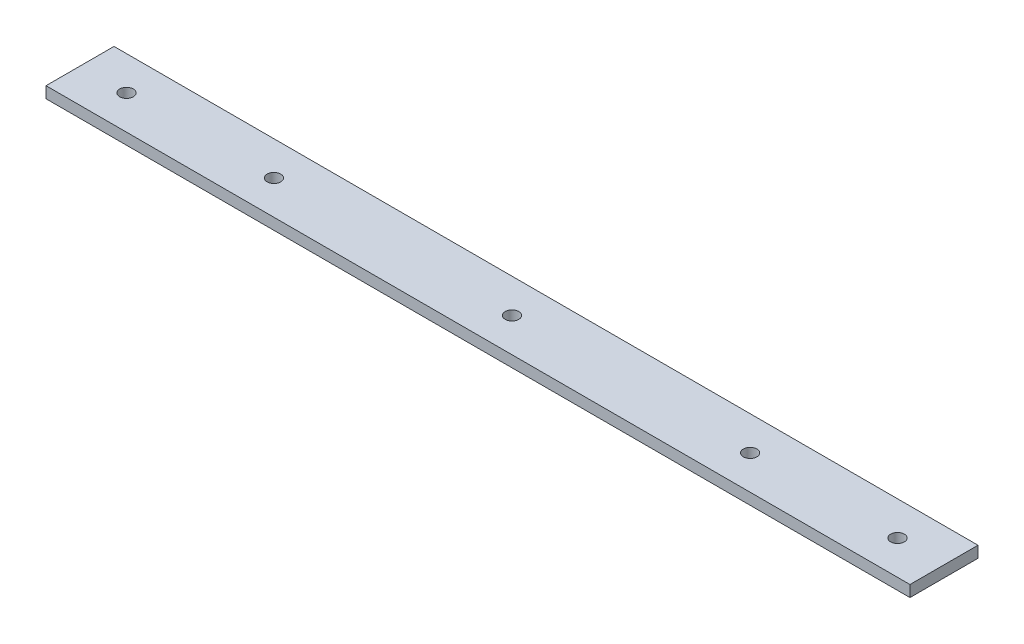
ISO-10303-21;
HEADER;
FILE_DESCRIPTION(('STEP AP214'),'2;1');
FILE_NAME('part.step','',(''),(''),'','','');
FILE_SCHEMA(('AUTOMOTIVE_DESIGN { 1 0 10303 214 1 1 1 1 }'));
ENDSEC;
DATA;
#1=APPLICATION_CONTEXT('core data for automotive mechanical design processes');
#2=APPLICATION_PROTOCOL_DEFINITION('international standard','automotive_design',2000,#1);
#3=PRODUCT_CONTEXT('',#1,'mechanical');
#4=PRODUCT('Part','Part','',(#3));
#5=PRODUCT_RELATED_PRODUCT_CATEGORY('part','',(#4));
#6=PRODUCT_DEFINITION_FORMATION('','',#4);
#7=PRODUCT_DEFINITION_CONTEXT('part definition',#1,'design');
#8=PRODUCT_DEFINITION('design','',#6,#7);
#9=PRODUCT_DEFINITION_SHAPE('','',#8);
#10=(LENGTH_UNIT() NAMED_UNIT(*) SI_UNIT(.MILLI.,.METRE.));
#11=(NAMED_UNIT(*) PLANE_ANGLE_UNIT() SI_UNIT($,.RADIAN.));
#12=(NAMED_UNIT(*) SI_UNIT($,.STERADIAN.) SOLID_ANGLE_UNIT());
#13=UNCERTAINTY_MEASURE_WITH_UNIT(LENGTH_MEASURE(1.E-05),#10,'distance_accuracy_value','');
#14=(GEOMETRIC_REPRESENTATION_CONTEXT(3) GLOBAL_UNCERTAINTY_ASSIGNED_CONTEXT((#13)) GLOBAL_UNIT_ASSIGNED_CONTEXT((#10,
#11,#12)) REPRESENTATION_CONTEXT('',''));
#15=CARTESIAN_POINT('',(0.,0.,0.));
#16=DIRECTION('',(0.,0.,1.));
#17=DIRECTION('',(1.,0.,0.));
#18=AXIS2_PLACEMENT_3D('',#15,#16,#17);
#19=CARTESIAN_POINT('',(0.,5.,0.));
#20=DIRECTION('',(0.,-1.,0.));
#21=DIRECTION('',(0.,0.,-1.));
#22=AXIS2_PLACEMENT_3D('',#19,#20,#21);
#23=PLANE('',#22);
#24=CARTESIAN_POINT('',(20.5,5.,-15.));
#25=DIRECTION('',(0.,1.,0.));
#26=DIRECTION('',(0.,0.,-1.));
#27=AXIS2_PLACEMENT_3D('',#24,#25,#26);
#28=CIRCLE('',#27,3.);
#29=CARTESIAN_POINT('',(20.5,5.,-18.));
#30=VERTEX_POINT('',#29);
#31=EDGE_CURVE('E127',#30,#30,#28,.T.);
#32=ORIENTED_EDGE('',*,*,#31,.F.);
#33=EDGE_LOOP('',(#32));
#34=FACE_BOUND('',#33,.T.);
#35=CARTESIAN_POINT('',(295.5,5.,-15.));
#36=DIRECTION('',(0.,1.,0.));
#37=DIRECTION('',(0.,0.,1.));
#38=AXIS2_PLACEMENT_3D('',#35,#36,#37);
#39=CIRCLE('',#38,2.99999999999999);
#40=CARTESIAN_POINT('',(295.5,5.,-12.));
#41=VERTEX_POINT('',#40);
#42=EDGE_CURVE('E115',#41,#41,#39,.T.);
#43=ORIENTED_EDGE('',*,*,#42,.F.);
#44=EDGE_LOOP('',(#43));
#45=FACE_BOUND('',#44,.T.);
#46=DIRECTION('',(0.,0.,1.));
#47=VECTOR('',#46,1.);
#48=CARTESIAN_POINT('',(0.,5.,0.));
#49=LINE('',#48,#47);
#50=CARTESIAN_POINT('',(0.,5.,-30.));
#51=VERTEX_POINT('',#50);
#52=CARTESIAN_POINT('',(0.,5.,0.));
#53=VERTEX_POINT('',#52);
#54=EDGE_CURVE('E85',#51,#53,#49,.T.);
#55=ORIENTED_EDGE('',*,*,#54,.T.);
#56=DIRECTION('',(1.,0.,0.));
#57=VECTOR('',#56,1.);
#58=CARTESIAN_POINT('',(0.,5.,0.));
#59=LINE('',#58,#57);
#60=CARTESIAN_POINT('',(381.,5.,0.));
#61=VERTEX_POINT('',#60);
#62=EDGE_CURVE('E80',#53,#61,#59,.T.);
#63=ORIENTED_EDGE('',*,*,#62,.T.);
#64=DIRECTION('',(0.,0.,-1.));
#65=VECTOR('',#64,1.);
#66=CARTESIAN_POINT('',(381.,5.,0.));
#67=LINE('',#66,#65);
#68=CARTESIAN_POINT('',(381.,5.,-30.));
#69=VERTEX_POINT('',#68);
#70=EDGE_CURVE('E83',#61,#69,#67,.T.);
#71=ORIENTED_EDGE('',*,*,#70,.T.);
#72=DIRECTION('',(-1.,0.,0.));
#73=VECTOR('',#72,1.);
#74=CARTESIAN_POINT('',(0.,5.,-30.));
#75=LINE('',#74,#73);
#76=EDGE_CURVE('E50',#69,#51,#75,.T.);
#77=ORIENTED_EDGE('',*,*,#76,.T.);
#78=EDGE_LOOP('',(#55,#63,#71,#77));
#79=FACE_BOUND('',#78,.T.);
#80=CARTESIAN_POINT('',(190.5,5.,-15.));
#81=DIRECTION('',(0.,1.,0.));
#82=DIRECTION('',(0.,0.,1.));
#83=AXIS2_PLACEMENT_3D('',#80,#81,#82);
#84=CIRCLE('',#83,2.99999999999999);
#85=CARTESIAN_POINT('',(190.5,5.,-12.));
#86=VERTEX_POINT('',#85);
#87=EDGE_CURVE('E100',#86,#86,#84,.T.);
#88=ORIENTED_EDGE('',*,*,#87,.F.);
#89=EDGE_LOOP('',(#88));
#90=FACE_BOUND('',#89,.T.);
#91=CARTESIAN_POINT('',(360.5,5.,-15.));
#92=DIRECTION('',(0.,1.,0.));
#93=DIRECTION('',(0.,0.,1.));
#94=AXIS2_PLACEMENT_3D('',#91,#92,#93);
#95=CIRCLE('',#94,2.99999999999999);
#96=CARTESIAN_POINT('',(360.5,5.,-12.));
#97=VERTEX_POINT('',#96);
#98=EDGE_CURVE('E121',#97,#97,#95,.T.);
#99=ORIENTED_EDGE('',*,*,#98,.F.);
#100=EDGE_LOOP('',(#99));
#101=FACE_BOUND('',#100,.T.);
#102=CARTESIAN_POINT('',(85.5,5.,-15.));
#103=DIRECTION('',(0.,1.,0.));
#104=DIRECTION('',(0.,0.,-1.));
#105=AXIS2_PLACEMENT_3D('',#102,#103,#104);
#106=CIRCLE('',#105,3.00000000000001);
#107=CARTESIAN_POINT('',(85.5,5.,-18.));
#108=VERTEX_POINT('',#107);
#109=EDGE_CURVE('E133',#108,#108,#106,.T.);
#110=ORIENTED_EDGE('',*,*,#109,.F.);
#111=EDGE_LOOP('',(#110));
#112=FACE_BOUND('',#111,.T.);
#113=ADVANCED_FACE('F33',(#34,#45,#79,#90,#101,#112),#23,.F.);
#114=CARTESIAN_POINT('',(0.,0.,0.));
#115=DIRECTION('',(0.,-1.,0.));
#116=DIRECTION('',(0.,0.,-1.));
#117=AXIS2_PLACEMENT_3D('',#114,#115,#116);
#118=PLANE('',#117);
#119=CARTESIAN_POINT('',(20.5,0.,-15.));
#120=DIRECTION('',(0.,1.,0.));
#121=DIRECTION('',(0.,0.,-1.));
#122=AXIS2_PLACEMENT_3D('',#119,#120,#121);
#123=CIRCLE('',#122,3.);
#124=CARTESIAN_POINT('',(20.5,0.,-18.));
#125=VERTEX_POINT('',#124);
#126=EDGE_CURVE('E130',#125,#125,#123,.T.);
#127=ORIENTED_EDGE('',*,*,#126,.T.);
#128=EDGE_LOOP('',(#127));
#129=FACE_BOUND('',#128,.T.);
#130=CARTESIAN_POINT('',(295.5,0.,-15.));
#131=DIRECTION('',(0.,1.,0.));
#132=DIRECTION('',(0.,0.,1.));
#133=AXIS2_PLACEMENT_3D('',#130,#131,#132);
#134=CIRCLE('',#133,2.99999999999999);
#135=CARTESIAN_POINT('',(295.5,0.,-12.));
#136=VERTEX_POINT('',#135);
#137=EDGE_CURVE('E118',#136,#136,#134,.T.);
#138=ORIENTED_EDGE('',*,*,#137,.T.);
#139=EDGE_LOOP('',(#138));
#140=FACE_BOUND('',#139,.T.);
#141=DIRECTION('',(0.,0.,1.));
#142=VECTOR('',#141,1.);
#143=CARTESIAN_POINT('',(0.,0.,0.));
#144=LINE('',#143,#142);
#145=CARTESIAN_POINT('',(0.,0.,-30.));
#146=VERTEX_POINT('',#145);
#147=CARTESIAN_POINT('',(0.,0.,0.));
#148=VERTEX_POINT('',#147);
#149=EDGE_CURVE('E97',#146,#148,#144,.T.);
#150=ORIENTED_EDGE('',*,*,#149,.F.);
#151=DIRECTION('',(-1.,0.,0.));
#152=VECTOR('',#151,1.);
#153=CARTESIAN_POINT('',(0.,0.,-30.));
#154=LINE('',#153,#152);
#155=CARTESIAN_POINT('',(381.,0.,-30.));
#156=VERTEX_POINT('',#155);
#157=EDGE_CURVE('E73',#156,#146,#154,.T.);
#158=ORIENTED_EDGE('',*,*,#157,.F.);
#159=DIRECTION('',(0.,0.,-1.));
#160=VECTOR('',#159,1.);
#161=CARTESIAN_POINT('',(381.,0.,0.));
#162=LINE('',#161,#160);
#163=CARTESIAN_POINT('',(381.,0.,0.));
#164=VERTEX_POINT('',#163);
#165=EDGE_CURVE('E67',#164,#156,#162,.T.);
#166=ORIENTED_EDGE('',*,*,#165,.F.);
#167=DIRECTION('',(1.,0.,0.));
#168=VECTOR('',#167,1.);
#169=CARTESIAN_POINT('',(0.,0.,0.));
#170=LINE('',#169,#168);
#171=EDGE_CURVE('E89',#148,#164,#170,.T.);
#172=ORIENTED_EDGE('',*,*,#171,.F.);
#173=EDGE_LOOP('',(#150,#158,#166,#172));
#174=FACE_BOUND('',#173,.T.);
#175=CARTESIAN_POINT('',(190.5,0.,-15.));
#176=DIRECTION('',(0.,1.,0.));
#177=DIRECTION('',(0.,0.,1.));
#178=AXIS2_PLACEMENT_3D('',#175,#176,#177);
#179=CIRCLE('',#178,2.99999999999999);
#180=CARTESIAN_POINT('',(190.5,0.,-12.));
#181=VERTEX_POINT('',#180);
#182=EDGE_CURVE('E112',#181,#181,#179,.T.);
#183=ORIENTED_EDGE('',*,*,#182,.T.);
#184=EDGE_LOOP('',(#183));
#185=FACE_BOUND('',#184,.T.);
#186=CARTESIAN_POINT('',(360.5,0.,-15.));
#187=DIRECTION('',(0.,1.,0.));
#188=DIRECTION('',(0.,0.,1.));
#189=AXIS2_PLACEMENT_3D('',#186,#187,#188);
#190=CIRCLE('',#189,2.99999999999999);
#191=CARTESIAN_POINT('',(360.5,0.,-12.));
#192=VERTEX_POINT('',#191);
#193=EDGE_CURVE('E124',#192,#192,#190,.T.);
#194=ORIENTED_EDGE('',*,*,#193,.T.);
#195=EDGE_LOOP('',(#194));
#196=FACE_BOUND('',#195,.T.);
#197=CARTESIAN_POINT('',(85.5,0.,-15.));
#198=DIRECTION('',(0.,1.,0.));
#199=DIRECTION('',(0.,0.,-1.));
#200=AXIS2_PLACEMENT_3D('',#197,#198,#199);
#201=CIRCLE('',#200,3.00000000000001);
#202=CARTESIAN_POINT('',(85.5,0.,-18.));
#203=VERTEX_POINT('',#202);
#204=EDGE_CURVE('E136',#203,#203,#201,.T.);
#205=ORIENTED_EDGE('',*,*,#204,.T.);
#206=EDGE_LOOP('',(#205));
#207=FACE_BOUND('',#206,.T.);
#208=ADVANCED_FACE('F108',(#129,#140,#174,#185,#196,#207),#118,.T.);
#209=CARTESIAN_POINT('',(0.,5.,0.));
#210=DIRECTION('',(1.,0.,0.));
#211=DIRECTION('',(0.,0.,-1.));
#212=AXIS2_PLACEMENT_3D('',#209,#210,#211);
#213=PLANE('',#212);
#214=ORIENTED_EDGE('',*,*,#149,.T.);
#215=DIRECTION('',(0.,-1.,0.));
#216=VECTOR('',#215,1.);
#217=CARTESIAN_POINT('',(0.,5.,0.));
#218=LINE('',#217,#216);
#219=EDGE_CURVE('E11',#53,#148,#218,.T.);
#220=ORIENTED_EDGE('',*,*,#219,.F.);
#221=ORIENTED_EDGE('',*,*,#54,.F.);
#222=DIRECTION('',(0.,-1.,0.));
#223=VECTOR('',#222,1.);
#224=CARTESIAN_POINT('',(0.,5.,-30.));
#225=LINE('',#224,#223);
#226=EDGE_CURVE('E93',#51,#146,#225,.T.);
#227=ORIENTED_EDGE('',*,*,#226,.T.);
#228=EDGE_LOOP('',(#214,#220,#221,#227));
#229=FACE_BOUND('',#228,.T.);
#230=ADVANCED_FACE('F35',(#229),#213,.F.);
#231=CARTESIAN_POINT('',(0.,5.,0.));
#232=DIRECTION('',(0.,0.,-1.));
#233=DIRECTION('',(-1.,0.,0.));
#234=AXIS2_PLACEMENT_3D('',#231,#232,#233);
#235=PLANE('',#234);
#236=ORIENTED_EDGE('',*,*,#171,.T.);
#237=DIRECTION('',(0.,-1.,0.));
#238=VECTOR('',#237,1.);
#239=CARTESIAN_POINT('',(381.,5.,0.));
#240=LINE('',#239,#238);
#241=EDGE_CURVE('E42',#61,#164,#240,.T.);
#242=ORIENTED_EDGE('',*,*,#241,.F.);
#243=ORIENTED_EDGE('',*,*,#62,.F.);
#244=ORIENTED_EDGE('',*,*,#219,.T.);
#245=EDGE_LOOP('',(#236,#242,#243,#244));
#246=FACE_BOUND('',#245,.T.);
#247=ADVANCED_FACE('F88',(#246),#235,.F.);
#248=CARTESIAN_POINT('',(381.,5.,0.));
#249=DIRECTION('',(-1.,0.,0.));
#250=DIRECTION('',(0.,0.,1.));
#251=AXIS2_PLACEMENT_3D('',#248,#249,#250);
#252=PLANE('',#251);
#253=ORIENTED_EDGE('',*,*,#165,.T.);
#254=DIRECTION('',(0.,-1.,0.));
#255=VECTOR('',#254,1.);
#256=CARTESIAN_POINT('',(381.,5.,-30.));
#257=LINE('',#256,#255);
#258=EDGE_CURVE('E90',#69,#156,#257,.T.);
#259=ORIENTED_EDGE('',*,*,#258,.F.);
#260=ORIENTED_EDGE('',*,*,#70,.F.);
#261=ORIENTED_EDGE('',*,*,#241,.T.);
#262=EDGE_LOOP('',(#253,#259,#260,#261));
#263=FACE_BOUND('',#262,.T.);
#264=ADVANCED_FACE('F91',(#263),#252,.F.);
#265=CARTESIAN_POINT('',(0.,5.,-30.));
#266=DIRECTION('',(0.,0.,1.));
#267=DIRECTION('',(1.,0.,0.));
#268=AXIS2_PLACEMENT_3D('',#265,#266,#267);
#269=PLANE('',#268);
#270=ORIENTED_EDGE('',*,*,#157,.T.);
#271=ORIENTED_EDGE('',*,*,#226,.F.);
#272=ORIENTED_EDGE('',*,*,#76,.F.);
#273=ORIENTED_EDGE('',*,*,#258,.T.);
#274=EDGE_LOOP('',(#270,#271,#272,#273));
#275=FACE_BOUND('',#274,.T.);
#276=ADVANCED_FACE('F105',(#275),#269,.F.);
#277=CARTESIAN_POINT('',(190.5,5.,-15.));
#278=DIRECTION('',(0.,-1.,0.));
#279=DIRECTION('',(0.,0.,-1.));
#280=AXIS2_PLACEMENT_3D('',#277,#278,#279);
#281=CYLINDRICAL_SURFACE('',#280,2.99999999999999);
#282=ORIENTED_EDGE('',*,*,#87,.T.);
#283=EDGE_LOOP('',(#282));
#284=FACE_BOUND('',#283,.T.);
#285=ORIENTED_EDGE('',*,*,#182,.F.);
#286=EDGE_LOOP('',(#285));
#287=FACE_BOUND('',#286,.T.);
#288=ADVANCED_FACE('F156',(#284,#287),#281,.F.);
#289=CARTESIAN_POINT('',(295.5,5.,-15.));
#290=DIRECTION('',(0.,-1.,0.));
#291=DIRECTION('',(0.,0.,-1.));
#292=AXIS2_PLACEMENT_3D('',#289,#290,#291);
#293=CYLINDRICAL_SURFACE('',#292,2.99999999999999);
#294=ORIENTED_EDGE('',*,*,#42,.T.);
#295=EDGE_LOOP('',(#294));
#296=FACE_BOUND('',#295,.T.);
#297=ORIENTED_EDGE('',*,*,#137,.F.);
#298=EDGE_LOOP('',(#297));
#299=FACE_BOUND('',#298,.T.);
#300=ADVANCED_FACE('F202',(#296,#299),#293,.F.);
#301=CARTESIAN_POINT('',(360.5,5.,-15.));
#302=DIRECTION('',(0.,-1.,0.));
#303=DIRECTION('',(0.,0.,-1.));
#304=AXIS2_PLACEMENT_3D('',#301,#302,#303);
#305=CYLINDRICAL_SURFACE('',#304,2.99999999999999);
#306=ORIENTED_EDGE('',*,*,#98,.T.);
#307=EDGE_LOOP('',(#306));
#308=FACE_BOUND('',#307,.T.);
#309=ORIENTED_EDGE('',*,*,#193,.F.);
#310=EDGE_LOOP('',(#309));
#311=FACE_BOUND('',#310,.T.);
#312=ADVANCED_FACE('F210',(#308,#311),#305,.F.);
#313=CARTESIAN_POINT('',(20.5,5.,-15.));
#314=DIRECTION('',(0.,-1.,0.));
#315=DIRECTION('',(0.,0.,-1.));
#316=AXIS2_PLACEMENT_3D('',#313,#314,#315);
#317=CYLINDRICAL_SURFACE('',#316,3.);
#318=ORIENTED_EDGE('',*,*,#31,.T.);
#319=EDGE_LOOP('',(#318));
#320=FACE_BOUND('',#319,.T.);
#321=ORIENTED_EDGE('',*,*,#126,.F.);
#322=EDGE_LOOP('',(#321));
#323=FACE_BOUND('',#322,.T.);
#324=ADVANCED_FACE('F218',(#320,#323),#317,.F.);
#325=CARTESIAN_POINT('',(85.5,5.,-15.));
#326=DIRECTION('',(0.,-1.,0.));
#327=DIRECTION('',(0.,0.,-1.));
#328=AXIS2_PLACEMENT_3D('',#325,#326,#327);
#329=CYLINDRICAL_SURFACE('',#328,3.00000000000001);
#330=ORIENTED_EDGE('',*,*,#109,.T.);
#331=EDGE_LOOP('',(#330));
#332=FACE_BOUND('',#331,.T.);
#333=ORIENTED_EDGE('',*,*,#204,.F.);
#334=EDGE_LOOP('',(#333));
#335=FACE_BOUND('',#334,.T.);
#336=ADVANCED_FACE('F142',(#332,#335),#329,.F.);
#337=CLOSED_SHELL('',(#113,#208,#230,#247,#264,#276,#288,#300,#312,#324,#336));
#338=MANIFOLD_SOLID_BREP('B2',#337);
#339=ADVANCED_BREP_SHAPE_REPRESENTATION('',(#18,#338),#14);
#340=SHAPE_DEFINITION_REPRESENTATION(#9,#339);
ENDSEC;
END-ISO-10303-21;
